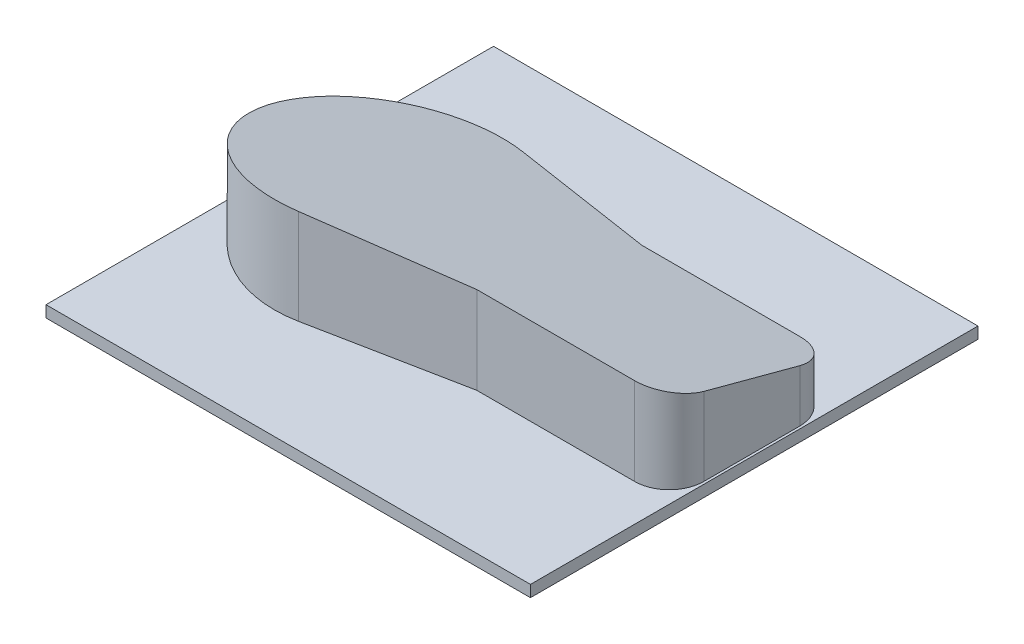
ISO-10303-21;
HEADER;
FILE_DESCRIPTION(('STEP AP214'),'2;1');
FILE_NAME('part.step','',(''),(''),'','','');
FILE_SCHEMA(('AUTOMOTIVE_DESIGN { 1 0 10303 214 1 1 1 1 }'));
ENDSEC;
DATA;
#1=APPLICATION_CONTEXT('core data for automotive mechanical design processes');
#2=APPLICATION_PROTOCOL_DEFINITION('international standard','automotive_design',2000,#1);
#3=PRODUCT_CONTEXT('',#1,'mechanical');
#4=PRODUCT('Part','Part','',(#3));
#5=PRODUCT_RELATED_PRODUCT_CATEGORY('part','',(#4));
#6=PRODUCT_DEFINITION_FORMATION('','',#4);
#7=PRODUCT_DEFINITION_CONTEXT('part definition',#1,'design');
#8=PRODUCT_DEFINITION('design','',#6,#7);
#9=PRODUCT_DEFINITION_SHAPE('','',#8);
#10=(LENGTH_UNIT() NAMED_UNIT(*) SI_UNIT(.MILLI.,.METRE.));
#11=(NAMED_UNIT(*) PLANE_ANGLE_UNIT() SI_UNIT($,.RADIAN.));
#12=(NAMED_UNIT(*) SI_UNIT($,.STERADIAN.) SOLID_ANGLE_UNIT());
#13=UNCERTAINTY_MEASURE_WITH_UNIT(LENGTH_MEASURE(1.E-05),#10,'distance_accuracy_value','');
#14=(GEOMETRIC_REPRESENTATION_CONTEXT(3) GLOBAL_UNCERTAINTY_ASSIGNED_CONTEXT((#13)) GLOBAL_UNIT_ASSIGNED_CONTEXT((#10,
#11,#12)) REPRESENTATION_CONTEXT('',''));
#15=CARTESIAN_POINT('',(0.,0.,0.));
#16=DIRECTION('',(0.,0.,1.));
#17=DIRECTION('',(1.,0.,0.));
#18=AXIS2_PLACEMENT_3D('',#15,#16,#17);
#19=CARTESIAN_POINT('',(0.,5.,0.));
#20=DIRECTION('',(1.,0.,0.));
#21=DIRECTION('',(0.,0.,-1.));
#22=AXIS2_PLACEMENT_3D('',#19,#20,#21);
#23=PLANE('',#22);
#24=DIRECTION('',(0.,0.,1.));
#25=VECTOR('',#24,1.);
#26=CARTESIAN_POINT('',(0.,0.,0.));
#27=LINE('',#26,#25);
#28=CARTESIAN_POINT('',(0.,0.,0.));
#29=VERTEX_POINT('',#28);
#30=CARTESIAN_POINT('',(0.,0.,194.));
#31=VERTEX_POINT('',#30);
#32=EDGE_CURVE('E357',#29,#31,#27,.T.);
#33=ORIENTED_EDGE('',*,*,#32,.T.);
#34=DIRECTION('',(0.,-1.,0.));
#35=VECTOR('',#34,1.);
#36=CARTESIAN_POINT('',(0.,5.,194.));
#37=LINE('',#36,#35);
#38=CARTESIAN_POINT('',(0.,5.,194.));
#39=VERTEX_POINT('',#38);
#40=EDGE_CURVE('E383',#39,#31,#37,.T.);
#41=ORIENTED_EDGE('',*,*,#40,.F.);
#42=DIRECTION('',(0.,0.,1.));
#43=VECTOR('',#42,1.);
#44=CARTESIAN_POINT('',(0.,5.,0.));
#45=LINE('',#44,#43);
#46=CARTESIAN_POINT('',(0.,5.,0.));
#47=VERTEX_POINT('',#46);
#48=EDGE_CURVE('E358',#47,#39,#45,.T.);
#49=ORIENTED_EDGE('',*,*,#48,.F.);
#50=DIRECTION('',(0.,-1.,0.));
#51=VECTOR('',#50,1.);
#52=CARTESIAN_POINT('',(0.,5.,0.));
#53=LINE('',#52,#51);
#54=EDGE_CURVE('E368',#47,#29,#53,.T.);
#55=ORIENTED_EDGE('',*,*,#54,.T.);
#56=EDGE_LOOP('',(#33,#41,#49,#55));
#57=FACE_BOUND('',#56,.T.);
#58=ADVANCED_FACE('F36',(#57),#23,.F.);
#59=CARTESIAN_POINT('',(0.,5.,194.));
#60=DIRECTION('',(0.,0.,-1.));
#61=DIRECTION('',(-1.,0.,0.));
#62=AXIS2_PLACEMENT_3D('',#59,#60,#61);
#63=PLANE('',#62);
#64=DIRECTION('',(1.,0.,0.));
#65=VECTOR('',#64,1.);
#66=CARTESIAN_POINT('',(0.,0.,194.));
#67=LINE('',#66,#65);
#68=CARTESIAN_POINT('',(210.,0.,194.));
#69=VERTEX_POINT('',#68);
#70=EDGE_CURVE('E370',#31,#69,#67,.T.);
#71=ORIENTED_EDGE('',*,*,#70,.T.);
#72=DIRECTION('',(0.,-1.,0.));
#73=VECTOR('',#72,1.);
#74=CARTESIAN_POINT('',(210.,5.,194.));
#75=LINE('',#74,#73);
#76=CARTESIAN_POINT('',(210.,5.,194.));
#77=VERTEX_POINT('',#76);
#78=EDGE_CURVE('E380',#77,#69,#75,.T.);
#79=ORIENTED_EDGE('',*,*,#78,.F.);
#80=DIRECTION('',(1.,0.,0.));
#81=VECTOR('',#80,1.);
#82=CARTESIAN_POINT('',(0.,5.,194.));
#83=LINE('',#82,#81);
#84=EDGE_CURVE('E361',#39,#77,#83,.T.);
#85=ORIENTED_EDGE('',*,*,#84,.F.);
#86=ORIENTED_EDGE('',*,*,#40,.T.);
#87=EDGE_LOOP('',(#71,#79,#85,#86));
#88=FACE_BOUND('',#87,.T.);
#89=ADVANCED_FACE('F280',(#88),#63,.F.);
#90=CARTESIAN_POINT('',(210.,5.,0.));
#91=DIRECTION('',(-1.,0.,0.));
#92=DIRECTION('',(0.,0.,1.));
#93=AXIS2_PLACEMENT_3D('',#90,#91,#92);
#94=PLANE('',#93);
#95=DIRECTION('',(0.,0.,-1.));
#96=VECTOR('',#95,1.);
#97=CARTESIAN_POINT('',(210.,0.,0.));
#98=LINE('',#97,#96);
#99=CARTESIAN_POINT('',(210.,0.,0.));
#100=VERTEX_POINT('',#99);
#101=EDGE_CURVE('E372',#69,#100,#98,.T.);
#102=ORIENTED_EDGE('',*,*,#101,.T.);
#103=DIRECTION('',(0.,-1.,0.));
#104=VECTOR('',#103,1.);
#105=CARTESIAN_POINT('',(210.,5.,0.));
#106=LINE('',#105,#104);
#107=CARTESIAN_POINT('',(210.,5.,0.));
#108=VERTEX_POINT('',#107);
#109=EDGE_CURVE('E377',#108,#100,#106,.T.);
#110=ORIENTED_EDGE('',*,*,#109,.F.);
#111=DIRECTION('',(0.,0.,-1.));
#112=VECTOR('',#111,1.);
#113=CARTESIAN_POINT('',(210.,5.,0.));
#114=LINE('',#113,#112);
#115=EDGE_CURVE('E364',#77,#108,#114,.T.);
#116=ORIENTED_EDGE('',*,*,#115,.F.);
#117=ORIENTED_EDGE('',*,*,#78,.T.);
#118=EDGE_LOOP('',(#102,#110,#116,#117));
#119=FACE_BOUND('',#118,.T.);
#120=ADVANCED_FACE('F286',(#119),#94,.F.);
#121=CARTESIAN_POINT('',(0.,5.,0.));
#122=DIRECTION('',(0.,0.,1.));
#123=DIRECTION('',(1.,0.,0.));
#124=AXIS2_PLACEMENT_3D('',#121,#122,#123);
#125=PLANE('',#124);
#126=DIRECTION('',(-1.,0.,0.));
#127=VECTOR('',#126,1.);
#128=CARTESIAN_POINT('',(0.,0.,0.));
#129=LINE('',#128,#127);
#130=EDGE_CURVE('E362',#100,#29,#129,.T.);
#131=ORIENTED_EDGE('',*,*,#130,.T.);
#132=ORIENTED_EDGE('',*,*,#54,.F.);
#133=DIRECTION('',(-1.,0.,0.));
#134=VECTOR('',#133,1.);
#135=CARTESIAN_POINT('',(0.,5.,0.));
#136=LINE('',#135,#134);
#137=EDGE_CURVE('E366',#108,#47,#136,.T.);
#138=ORIENTED_EDGE('',*,*,#137,.F.);
#139=ORIENTED_EDGE('',*,*,#109,.T.);
#140=EDGE_LOOP('',(#131,#132,#138,#139));
#141=FACE_BOUND('',#140,.T.);
#142=ADVANCED_FACE('F438',(#141),#125,.F.);
#143=CARTESIAN_POINT('',(0.,5.,0.));
#144=DIRECTION('',(0.,1.,0.));
#145=DIRECTION('',(0.,0.,1.));
#146=AXIS2_PLACEMENT_3D('',#143,#144,#145);
#147=PLANE('',#146);
#148=CARTESIAN_POINT('',(51.45,5.,97.));
#149=DIRECTION('',(0.,1.,0.));
#150=DIRECTION('',(0.,0.,1.));
#151=AXIS2_PLACEMENT_3D('',#148,#149,#150);
#152=CIRCLE('',#151,49.45);
#153=CARTESIAN_POINT('',(61.0263246268657,5.,48.4861204742304));
#154=VERTEX_POINT('',#153);
#155=CARTESIAN_POINT('',(61.0263246268657,5.,145.51387952577));
#156=VERTEX_POINT('',#155);
#157=EDGE_CURVE('E341',#154,#156,#152,.T.);
#158=ORIENTED_EDGE('',*,*,#157,.F.);
#159=DIRECTION('',(-0.981069353402823,0.,-0.193656716417911));
#160=VECTOR('',#159,1.);
#161=CARTESIAN_POINT('',(61.0263246268657,5.,48.4861204742304));
#162=LINE('',#161,#160);
#163=CARTESIAN_POINT('',(125.513628731343,5.,61.215495334632));
#164=VERTEX_POINT('',#163);
#165=EDGE_CURVE('E346',#164,#154,#162,.T.);
#166=ORIENTED_EDGE('',*,*,#165,.F.);
#167=DIRECTION('',(-1.,0.,0.));
#168=VECTOR('',#167,1.);
#169=CARTESIAN_POINT('',(125.513628731343,5.,61.215495334632));
#170=LINE('',#169,#168);
#171=CARTESIAN_POINT('',(193.95,5.,61.215495334632));
#172=VERTEX_POINT('',#171);
#173=EDGE_CURVE('E339',#172,#164,#170,.T.);
#174=ORIENTED_EDGE('',*,*,#173,.F.);
#175=CARTESIAN_POINT('',(193.95,5.,76.215495334632));
#176=DIRECTION('',(0.,1.,0.));
#177=DIRECTION('',(0.,0.,1.));
#178=AXIS2_PLACEMENT_3D('',#175,#176,#177);
#179=CIRCLE('',#178,15.);
#180=CARTESIAN_POINT('',(208.95,5.,76.215495334632));
#181=VERTEX_POINT('',#180);
#182=EDGE_CURVE('E11',#172,#181,#179,.F.);
#183=ORIENTED_EDGE('',*,*,#182,.T.);
#184=DIRECTION('',(0.,0.,-1.));
#185=VECTOR('',#184,1.);
#186=CARTESIAN_POINT('',(208.95,5.,61.215495334632));
#187=LINE('',#186,#185);
#188=CARTESIAN_POINT('',(208.95,5.,117.784504665368));
#189=VERTEX_POINT('',#188);
#190=EDGE_CURVE('E332',#189,#181,#187,.T.);
#191=ORIENTED_EDGE('',*,*,#190,.F.);
#192=CARTESIAN_POINT('',(193.95,5.,117.784504665368));
#193=DIRECTION('',(0.,1.,0.));
#194=DIRECTION('',(0.,0.,1.));
#195=AXIS2_PLACEMENT_3D('',#192,#193,#194);
#196=CIRCLE('',#195,15.);
#197=CARTESIAN_POINT('',(193.95,5.,132.784504665368));
#198=VERTEX_POINT('',#197);
#199=EDGE_CURVE('E44',#189,#198,#196,.F.);
#200=ORIENTED_EDGE('',*,*,#199,.T.);
#201=DIRECTION('',(1.,0.,0.));
#202=VECTOR('',#201,1.);
#203=CARTESIAN_POINT('',(208.95,5.,132.784504665368));
#204=LINE('',#203,#202);
#205=CARTESIAN_POINT('',(125.513628731343,5.,132.784504665368));
#206=VERTEX_POINT('',#205);
#207=EDGE_CURVE('E329',#206,#198,#204,.T.);
#208=ORIENTED_EDGE('',*,*,#207,.F.);
#209=DIRECTION('',(0.981069353402823,0.,-0.193656716417911));
#210=VECTOR('',#209,1.);
#211=CARTESIAN_POINT('',(61.0263246268657,5.,145.51387952577));
#212=LINE('',#211,#210);
#213=EDGE_CURVE('E337',#156,#206,#212,.T.);
#214=ORIENTED_EDGE('',*,*,#213,.F.);
#215=EDGE_LOOP('',(#158,#166,#174,#183,#191,#200,#208,#214));
#216=FACE_BOUND('',#215,.T.);
#217=ORIENTED_EDGE('',*,*,#48,.T.);
#218=ORIENTED_EDGE('',*,*,#84,.T.);
#219=ORIENTED_EDGE('',*,*,#115,.T.);
#220=ORIENTED_EDGE('',*,*,#137,.T.);
#221=EDGE_LOOP('',(#217,#218,#219,#220));
#222=FACE_BOUND('',#221,.T.);
#223=ADVANCED_FACE('F326',(#216,#222),#147,.T.);
#224=CARTESIAN_POINT('',(0.,0.,0.));
#225=DIRECTION('',(0.,1.,0.));
#226=DIRECTION('',(0.,0.,1.));
#227=AXIS2_PLACEMENT_3D('',#224,#225,#226);
#228=PLANE('',#227);
#229=DIRECTION('',(-0.981069353402823,0.,0.193656716417911));
#230=VECTOR('',#229,1.);
#231=CARTESIAN_POINT('',(124.536092452337,0.,122.784504665368));
#232=LINE('',#231,#230);
#233=CARTESIAN_POINT('',(124.536092452337,0.,122.784504665368));
#234=VERTEX_POINT('',#233);
#235=CARTESIAN_POINT('',(59.0897574626866,0.,135.703185991741));
#236=VERTEX_POINT('',#235);
#237=EDGE_CURVE('E684',#234,#236,#232,.T.);
#238=ORIENTED_EDGE('',*,*,#237,.F.);
#239=DIRECTION('',(-1.,0.,0.));
#240=VECTOR('',#239,1.);
#241=CARTESIAN_POINT('',(193.95,0.,122.784504665368));
#242=LINE('',#241,#240);
#243=CARTESIAN_POINT('',(193.95,0.,122.784504665368));
#244=VERTEX_POINT('',#243);
#245=EDGE_CURVE('E56',#244,#234,#242,.T.);
#246=ORIENTED_EDGE('',*,*,#245,.F.);
#247=CARTESIAN_POINT('',(193.95,0.,117.784504665368));
#248=DIRECTION('',(0.,-1.,0.));
#249=DIRECTION('',(0.,0.,-1.));
#250=AXIS2_PLACEMENT_3D('',#247,#248,#249);
#251=CIRCLE('',#250,4.99999999999998);
#252=CARTESIAN_POINT('',(198.95,0.,117.784504665368));
#253=VERTEX_POINT('',#252);
#254=EDGE_CURVE('E699',#253,#244,#251,.T.);
#255=ORIENTED_EDGE('',*,*,#254,.F.);
#256=DIRECTION('',(0.,0.,1.));
#257=VECTOR('',#256,1.);
#258=CARTESIAN_POINT('',(198.95,0.,76.215495334632));
#259=LINE('',#258,#257);
#260=CARTESIAN_POINT('',(198.95,0.,76.215495334632));
#261=VERTEX_POINT('',#260);
#262=EDGE_CURVE('E697',#261,#253,#259,.T.);
#263=ORIENTED_EDGE('',*,*,#262,.F.);
#264=CARTESIAN_POINT('',(193.95,0.,76.215495334632));
#265=DIRECTION('',(0.,-1.,0.));
#266=DIRECTION('',(0.,0.,-1.));
#267=AXIS2_PLACEMENT_3D('',#264,#265,#266);
#268=CIRCLE('',#267,5.);
#269=CARTESIAN_POINT('',(193.95,0.,71.215495334632));
#270=VERTEX_POINT('',#269);
#271=EDGE_CURVE('E208',#270,#261,#268,.T.);
#272=ORIENTED_EDGE('',*,*,#271,.F.);
#273=DIRECTION('',(1.,0.,0.));
#274=VECTOR('',#273,1.);
#275=CARTESIAN_POINT('',(124.536092452337,0.,71.215495334632));
#276=LINE('',#275,#274);
#277=CARTESIAN_POINT('',(124.536092452337,0.,71.215495334632));
#278=VERTEX_POINT('',#277);
#279=EDGE_CURVE('E693',#278,#270,#276,.T.);
#280=ORIENTED_EDGE('',*,*,#279,.F.);
#281=DIRECTION('',(0.981069353402823,0.,0.193656716417911));
#282=VECTOR('',#281,1.);
#283=CARTESIAN_POINT('',(59.0897574626865,0.,58.2968140082586));
#284=LINE('',#283,#282);
#285=CARTESIAN_POINT('',(59.0897574626865,0.,58.2968140082586));
#286=VERTEX_POINT('',#285);
#287=EDGE_CURVE('E690',#286,#278,#284,.T.);
#288=ORIENTED_EDGE('',*,*,#287,.F.);
#289=CARTESIAN_POINT('',(51.45,0.,97.));
#290=DIRECTION('',(0.,-1.,0.));
#291=DIRECTION('',(0.,0.,-1.));
#292=AXIS2_PLACEMENT_3D('',#289,#290,#291);
#293=CIRCLE('',#292,39.45);
#294=EDGE_CURVE('E687',#236,#286,#293,.T.);
#295=ORIENTED_EDGE('',*,*,#294,.F.);
#296=EDGE_LOOP('',(#238,#246,#255,#263,#272,#280,#288,#295));
#297=FACE_BOUND('',#296,.T.);
#298=ORIENTED_EDGE('',*,*,#32,.F.);
#299=ORIENTED_EDGE('',*,*,#130,.F.);
#300=ORIENTED_EDGE('',*,*,#101,.F.);
#301=ORIENTED_EDGE('',*,*,#70,.F.);
#302=EDGE_LOOP('',(#298,#299,#300,#301));
#303=FACE_BOUND('',#302,.T.);
#304=ADVANCED_FACE('F432',(#297,#303),#228,.F.);
#305=CARTESIAN_POINT('',(51.45,55.,97.));
#306=DIRECTION('',(0.,-1.,0.));
#307=DIRECTION('',(0.,0.,-1.));
#308=AXIS2_PLACEMENT_3D('',#305,#306,#307);
#309=CYLINDRICAL_SURFACE('',#308,49.45);
#310=CARTESIAN_POINT('',(51.45,33.2500875657191,97.));
#311=DIRECTION('',(0.,-0.965925826289068,0.258819045102522));
#312=DIRECTION('',(0.,-0.258819045102522,-0.965925826289068));
#313=AXIS2_PLACEMENT_3D('',#310,#311,#312);
#314=ELLIPSE('',#313,51.1944071212786,49.45);
#315=CARTESIAN_POINT('',(61.0263246268657,46.2493424063499,145.51387952577));
#316=VERTEX_POINT('',#315);
#317=CARTESIAN_POINT('',(61.0263246268657,20.2508327250883,48.4861204742304));
#318=VERTEX_POINT('',#317);
#319=EDGE_CURVE('E408',#316,#318,#314,.T.);
#320=ORIENTED_EDGE('',*,*,#319,.T.);
#321=DIRECTION('',(0.,-1.,0.));
#322=VECTOR('',#321,1.);
#323=CARTESIAN_POINT('',(61.0263246268657,55.,48.4861204742304));
#324=LINE('',#323,#322);
#325=EDGE_CURVE('E349',#318,#154,#324,.T.);
#326=ORIENTED_EDGE('',*,*,#325,.T.);
#327=ORIENTED_EDGE('',*,*,#157,.T.);
#328=DIRECTION('',(0.,-1.,0.));
#329=VECTOR('',#328,1.);
#330=CARTESIAN_POINT('',(61.0263246268657,55.,145.51387952577));
#331=LINE('',#330,#329);
#332=EDGE_CURVE('E355',#316,#156,#331,.T.);
#333=ORIENTED_EDGE('',*,*,#332,.F.);
#334=EDGE_LOOP('',(#320,#326,#327,#333));
#335=FACE_BOUND('',#334,.T.);
#336=ADVANCED_FACE('F412',(#335),#309,.T.);
#337=CARTESIAN_POINT('',(61.0263246268657,55.,145.51387952577));
#338=DIRECTION('',(-0.193656716417911,0.,-0.981069353402823));
#339=DIRECTION('',(-0.981069353402823,0.,0.193656716417911));
#340=AXIS2_PLACEMENT_3D('',#337,#338,#339);
#341=PLANE('',#340);
#342=DIRECTION('',(0.,-1.,0.));
#343=VECTOR('',#342,1.);
#344=CARTESIAN_POINT('',(125.513628731343,55.,132.784504665368));
#345=LINE('',#344,#343);
#346=CARTESIAN_POINT('',(125.513628731343,42.8385166923522,132.784504665368));
#347=VERTEX_POINT('',#346);
#348=EDGE_CURVE('E336',#347,#206,#345,.T.);
#349=ORIENTED_EDGE('',*,*,#348,.F.);
#350=DIRECTION('',(-0.979751206557731,0.0518204421018015,0.193396522794604));
#351=VECTOR('',#350,1.);
#352=CARTESIAN_POINT('',(60.582043759192,46.2728410566461,145.601577682584));
#353=LINE('',#352,#351);
#354=EDGE_CURVE('E399',#347,#316,#353,.T.);
#355=ORIENTED_EDGE('',*,*,#354,.T.);
#356=ORIENTED_EDGE('',*,*,#332,.T.);
#357=ORIENTED_EDGE('',*,*,#213,.T.);
#358=EDGE_LOOP('',(#349,#355,#356,#357));
#359=FACE_BOUND('',#358,.T.);
#360=ADVANCED_FACE('F424',(#359),#341,.F.);
#361=CARTESIAN_POINT('',(208.95,55.,132.784504665368));
#362=DIRECTION('',(0.,0.,-1.));
#363=DIRECTION('',(-1.,0.,0.));
#364=AXIS2_PLACEMENT_3D('',#361,#362,#363);
#365=PLANE('',#364);
#366=ORIENTED_EDGE('',*,*,#207,.T.);
#367=DIRECTION('',(0.,-1.,0.));
#368=VECTOR('',#367,1.);
#369=CARTESIAN_POINT('',(193.95,55.,132.784504665368));
#370=LINE('',#369,#368);
#371=CARTESIAN_POINT('',(193.95,42.8385166923522,132.784504665368));
#372=VERTEX_POINT('',#371);
#373=EDGE_CURVE('E308',#198,#372,#370,.F.);
#374=ORIENTED_EDGE('',*,*,#373,.T.);
#375=DIRECTION('',(-1.,0.,0.));
#376=VECTOR('',#375,1.);
#377=CARTESIAN_POINT('',(208.95,42.8385166923522,132.784504665368));
#378=LINE('',#377,#376);
#379=EDGE_CURVE('E396',#372,#347,#378,.T.);
#380=ORIENTED_EDGE('',*,*,#379,.T.);
#381=ORIENTED_EDGE('',*,*,#348,.T.);
#382=EDGE_LOOP('',(#366,#374,#380,#381));
#383=FACE_BOUND('',#382,.T.);
#384=ADVANCED_FACE('F334',(#383),#365,.F.);
#385=CARTESIAN_POINT('',(208.95,55.,61.215495334632));
#386=DIRECTION('',(-1.,0.,0.));
#387=DIRECTION('',(0.,0.,1.));
#388=AXIS2_PLACEMENT_3D('',#385,#386,#387);
#389=PLANE('',#388);
#390=DIRECTION('',(0.,0.258819045102522,0.965925826289068));
#391=VECTOR('',#390,1.);
#392=CARTESIAN_POINT('',(208.95,25.7609292674304,69.0500807248606));
#393=LINE('',#392,#391);
#394=CARTESIAN_POINT('',(208.95,27.6808963255528,76.215495334632));
#395=VERTEX_POINT('',#394);
#396=CARTESIAN_POINT('',(208.95,38.8192788058854,117.784504665368));
#397=VERTEX_POINT('',#396);
#398=EDGE_CURVE('E394',#395,#397,#393,.T.);
#399=ORIENTED_EDGE('',*,*,#398,.T.);
#400=DIRECTION('',(0.,-1.,0.));
#401=VECTOR('',#400,1.);
#402=CARTESIAN_POINT('',(208.95,55.,117.784504665368));
#403=LINE('',#402,#401);
#404=EDGE_CURVE('E310',#397,#189,#403,.T.);
#405=ORIENTED_EDGE('',*,*,#404,.T.);
#406=ORIENTED_EDGE('',*,*,#190,.T.);
#407=DIRECTION('',(0.,-1.,0.));
#408=VECTOR('',#407,1.);
#409=CARTESIAN_POINT('',(208.95,55.,76.215495334632));
#410=LINE('',#409,#408);
#411=EDGE_CURVE('E389',#181,#395,#410,.F.);
#412=ORIENTED_EDGE('',*,*,#411,.T.);
#413=EDGE_LOOP('',(#399,#405,#406,#412));
#414=FACE_BOUND('',#413,.T.);
#415=ADVANCED_FACE('F392',(#414),#389,.F.);
#416=CARTESIAN_POINT('',(125.513628731343,55.,61.215495334632));
#417=DIRECTION('',(0.,0.,1.));
#418=DIRECTION('',(1.,0.,0.));
#419=AXIS2_PLACEMENT_3D('',#416,#417,#418);
#420=PLANE('',#419);
#421=DIRECTION('',(1.,0.,0.));
#422=VECTOR('',#421,1.);
#423=CARTESIAN_POINT('',(125.513628731343,23.6616584390859,61.215495334632));
#424=LINE('',#423,#422);
#425=CARTESIAN_POINT('',(125.513628731343,23.6616584390859,61.215495334632));
#426=VERTEX_POINT('',#425);
#427=CARTESIAN_POINT('',(193.95,23.6616584390859,61.215495334632));
#428=VERTEX_POINT('',#427);
#429=EDGE_CURVE('E397',#426,#428,#424,.T.);
#430=ORIENTED_EDGE('',*,*,#429,.T.);
#431=DIRECTION('',(0.,-1.,0.));
#432=VECTOR('',#431,1.);
#433=CARTESIAN_POINT('',(193.95,55.,61.215495334632));
#434=LINE('',#433,#432);
#435=EDGE_CURVE('E314',#428,#172,#434,.T.);
#436=ORIENTED_EDGE('',*,*,#435,.T.);
#437=ORIENTED_EDGE('',*,*,#173,.T.);
#438=DIRECTION('',(0.,-1.,0.));
#439=VECTOR('',#438,1.);
#440=CARTESIAN_POINT('',(125.513628731343,55.,61.215495334632));
#441=LINE('',#440,#439);
#442=EDGE_CURVE('E351',#426,#164,#441,.T.);
#443=ORIENTED_EDGE('',*,*,#442,.F.);
#444=EDGE_LOOP('',(#430,#436,#437,#443));
#445=FACE_BOUND('',#444,.T.);
#446=ADVANCED_FACE('F420',(#445),#420,.F.);
#447=CARTESIAN_POINT('',(61.0263246268657,55.,48.4861204742304));
#448=DIRECTION('',(-0.193656716417911,0.,0.981069353402823));
#449=DIRECTION('',(0.981069353402823,0.,0.193656716417911));
#450=AXIS2_PLACEMENT_3D('',#447,#448,#449);
#451=PLANE('',#450);
#452=ORIENTED_EDGE('',*,*,#325,.F.);
#453=DIRECTION('',(0.979751206557731,0.0518204421018015,0.193396522794604));
#454=VECTOR('',#453,1.);
#455=CARTESIAN_POINT('',(62.7905794868705,20.3441466870551,48.8343729213462));
#456=LINE('',#455,#454);
#457=EDGE_CURVE('E386',#318,#426,#456,.T.);
#458=ORIENTED_EDGE('',*,*,#457,.T.);
#459=ORIENTED_EDGE('',*,*,#442,.T.);
#460=ORIENTED_EDGE('',*,*,#165,.T.);
#461=EDGE_LOOP('',(#452,#458,#459,#460));
#462=FACE_BOUND('',#461,.T.);
#463=ADVANCED_FACE('F301',(#462),#451,.F.);
#464=CARTESIAN_POINT('',(210.,46.5001751314381,146.45));
#465=DIRECTION('',(0.,-0.965925826289068,0.258819045102522));
#466=DIRECTION('',(0.,-0.258819045102522,-0.965925826289068));
#467=AXIS2_PLACEMENT_3D('',#464,#465,#466);
#468=PLANE('',#467);
#469=ORIENTED_EDGE('',*,*,#379,.F.);
#470=CARTESIAN_POINT('',(193.95,38.8192788058854,117.784504665368));
#471=DIRECTION('',(0.,-0.965925826289068,0.258819045102522));
#472=DIRECTION('',(0.,-0.258819045102522,-0.965925826289068));
#473=AXIS2_PLACEMENT_3D('',#470,#471,#472);
#474=ELLIPSE('',#473,15.5291427061512,15.);
#475=EDGE_CURVE('E307',#372,#397,#474,.F.);
#476=ORIENTED_EDGE('',*,*,#475,.T.);
#477=ORIENTED_EDGE('',*,*,#398,.F.);
#478=CARTESIAN_POINT('',(193.95,27.6808963255528,76.215495334632));
#479=DIRECTION('',(0.,-0.965925826289068,0.258819045102522));
#480=DIRECTION('',(0.,-0.258819045102522,-0.965925826289068));
#481=AXIS2_PLACEMENT_3D('',#478,#479,#480);
#482=ELLIPSE('',#481,15.5291427061512,15.);
#483=EDGE_CURVE('E315',#395,#428,#482,.F.);
#484=ORIENTED_EDGE('',*,*,#483,.T.);
#485=ORIENTED_EDGE('',*,*,#429,.F.);
#486=ORIENTED_EDGE('',*,*,#457,.F.);
#487=ORIENTED_EDGE('',*,*,#319,.F.);
#488=ORIENTED_EDGE('',*,*,#354,.F.);
#489=EDGE_LOOP('',(#469,#476,#477,#484,#485,#486,#487,#488));
#490=FACE_BOUND('',#489,.T.);
#491=ADVANCED_FACE('F293',(#490),#468,.F.);
#492=CARTESIAN_POINT('',(193.95,55.,117.784504665368));
#493=DIRECTION('',(0.,-1.,0.));
#494=DIRECTION('',(0.,0.,-1.));
#495=AXIS2_PLACEMENT_3D('',#492,#493,#494);
#496=CYLINDRICAL_SURFACE('',#495,15.);
#497=ORIENTED_EDGE('',*,*,#475,.F.);
#498=ORIENTED_EDGE('',*,*,#373,.F.);
#499=ORIENTED_EDGE('',*,*,#199,.F.);
#500=ORIENTED_EDGE('',*,*,#404,.F.);
#501=EDGE_LOOP('',(#497,#498,#499,#500));
#502=FACE_BOUND('',#501,.T.);
#503=ADVANCED_FACE('F291',(#502),#496,.T.);
#504=CARTESIAN_POINT('',(193.95,55.,76.215495334632));
#505=DIRECTION('',(0.,-1.,0.));
#506=DIRECTION('',(0.,0.,-1.));
#507=AXIS2_PLACEMENT_3D('',#504,#505,#506);
#508=CYLINDRICAL_SURFACE('',#507,15.);
#509=ORIENTED_EDGE('',*,*,#483,.F.);
#510=ORIENTED_EDGE('',*,*,#411,.F.);
#511=ORIENTED_EDGE('',*,*,#182,.F.);
#512=ORIENTED_EDGE('',*,*,#435,.F.);
#513=EDGE_LOOP('',(#509,#510,#511,#512));
#514=FACE_BOUND('',#513,.T.);
#515=ADVANCED_FACE('F38',(#514),#508,.T.);
#516=CARTESIAN_POINT('',(193.95,15.,122.784504665368));
#517=DIRECTION('',(0.,0.,1.));
#518=DIRECTION('',(1.,0.,0.));
#519=AXIS2_PLACEMENT_3D('',#516,#517,#518);
#520=PLANE('',#519);
#521=ORIENTED_EDGE('',*,*,#245,.T.);
#522=DIRECTION('',(0.,-1.,0.));
#523=VECTOR('',#522,1.);
#524=CARTESIAN_POINT('',(124.536092452337,15.,122.784504665368));
#525=LINE('',#524,#523);
#526=CARTESIAN_POINT('',(124.536092452337,29.8062629639401,122.784504665368));
#527=VERTEX_POINT('',#526);
#528=EDGE_CURVE('E51',#527,#234,#525,.T.);
#529=ORIENTED_EDGE('',*,*,#528,.F.);
#530=DIRECTION('',(-1.,0.,0.));
#531=VECTOR('',#530,1.);
#532=CARTESIAN_POINT('',(197.364055751034,29.8062629639401,122.784504665368));
#533=LINE('',#532,#531);
#534=CARTESIAN_POINT('',(193.95,29.8062629639402,122.784504665368));
#535=VERTEX_POINT('',#534);
#536=EDGE_CURVE('E231',#535,#527,#533,.T.);
#537=ORIENTED_EDGE('',*,*,#536,.F.);
#538=DIRECTION('',(0.,-1.,0.));
#539=VECTOR('',#538,1.);
#540=CARTESIAN_POINT('',(193.95,15.,122.784504665368));
#541=LINE('',#540,#539);
#542=EDGE_CURVE('E402',#535,#244,#541,.T.);
#543=ORIENTED_EDGE('',*,*,#542,.T.);
#544=EDGE_LOOP('',(#521,#529,#537,#543));
#545=FACE_BOUND('',#544,.T.);
#546=ADVANCED_FACE('F299',(#545),#520,.F.);
#547=CARTESIAN_POINT('',(193.95,15.,117.784504665368));
#548=DIRECTION('',(0.,-1.,0.));
#549=DIRECTION('',(0.,0.,-1.));
#550=AXIS2_PLACEMENT_3D('',#547,#548,#549);
#551=CYLINDRICAL_SURFACE('',#550,4.99999999999998);
#552=ORIENTED_EDGE('',*,*,#254,.T.);
#553=ORIENTED_EDGE('',*,*,#542,.F.);
#554=CARTESIAN_POINT('',(193.95,28.4665170017845,117.784504665368));
#555=DIRECTION('',(0.,-0.965925826289067,0.258819045102526));
#556=DIRECTION('',(0.,-0.258819045102526,-0.965925826289067));
#557=AXIS2_PLACEMENT_3D('',#554,#555,#556);
#558=ELLIPSE('',#557,5.17638090205041,4.99999999999998);
#559=CARTESIAN_POINT('',(198.95,28.4665170017845,117.784504665368));
#560=VERTEX_POINT('',#559);
#561=EDGE_CURVE('E254',#560,#535,#558,.T.);
#562=ORIENTED_EDGE('',*,*,#561,.F.);
#563=DIRECTION('',(0.,-1.,0.));
#564=VECTOR('',#563,1.);
#565=CARTESIAN_POINT('',(198.95,15.,117.784504665368));
#566=LINE('',#565,#564);
#567=EDGE_CURVE('E212',#560,#253,#566,.T.);
#568=ORIENTED_EDGE('',*,*,#567,.T.);
#569=EDGE_LOOP('',(#552,#553,#562,#568));
#570=FACE_BOUND('',#569,.T.);
#571=ADVANCED_FACE('F528',(#570),#551,.F.);
#572=CARTESIAN_POINT('',(198.95,15.,76.215495334632));
#573=DIRECTION('',(1.,0.,0.));
#574=DIRECTION('',(0.,0.,-1.));
#575=AXIS2_PLACEMENT_3D('',#572,#573,#574);
#576=PLANE('',#575);
#577=ORIENTED_EDGE('',*,*,#262,.T.);
#578=ORIENTED_EDGE('',*,*,#567,.F.);
#579=DIRECTION('',(0.,-0.258819045102522,-0.965925826289068));
#580=VECTOR('',#579,1.);
#581=CARTESIAN_POINT('',(198.95,29.1600205429947,120.372695116393));
#582=LINE('',#581,#580);
#583=CARTESIAN_POINT('',(198.95,29.1600205429947,120.372695116393));
#584=VERTEX_POINT('',#583);
#585=EDGE_CURVE('E643',#584,#560,#582,.T.);
#586=ORIENTED_EDGE('',*,*,#585,.F.);
#587=DIRECTION('',(0.,0.965925826289068,-0.258819045102522));
#588=VECTOR('',#587,1.);
#589=CARTESIAN_POINT('',(198.95,29.1600205429947,120.372695116393));
#590=LINE('',#589,#588);
#591=CARTESIAN_POINT('',(198.95,33.98964967444,119.078599890881));
#592=VERTEX_POINT('',#591);
#593=EDGE_CURVE('E219',#584,#592,#590,.T.);
#594=ORIENTED_EDGE('',*,*,#593,.T.);
#595=DIRECTION('',(0.,-0.258819045102522,-0.965925826289068));
#596=VECTOR('',#595,1.);
#597=CARTESIAN_POINT('',(198.95,33.98964967444,119.078599890881));
#598=LINE('',#597,#596);
#599=CARTESIAN_POINT('',(198.95,22.5045154235022,76.215495334632));
#600=VERTEX_POINT('',#599);
#601=EDGE_CURVE('E216',#592,#600,#598,.T.);
#602=ORIENTED_EDGE('',*,*,#601,.T.);
#603=DIRECTION('',(0.,-1.,0.));
#604=VECTOR('',#603,1.);
#605=CARTESIAN_POINT('',(198.95,15.,76.215495334632));
#606=LINE('',#605,#604);
#607=EDGE_CURVE('E201',#600,#261,#606,.T.);
#608=ORIENTED_EDGE('',*,*,#607,.T.);
#609=EDGE_LOOP('',(#577,#578,#586,#594,#602,#608));
#610=FACE_BOUND('',#609,.T.);
#611=ADVANCED_FACE('F217',(#610),#576,.F.);
#612=CARTESIAN_POINT('',(193.95,15.,76.215495334632));
#613=DIRECTION('',(0.,-1.,0.));
#614=DIRECTION('',(0.,0.,-1.));
#615=AXIS2_PLACEMENT_3D('',#612,#613,#614);
#616=CYLINDRICAL_SURFACE('',#615,5.);
#617=ORIENTED_EDGE('',*,*,#271,.T.);
#618=ORIENTED_EDGE('',*,*,#607,.F.);
#619=CARTESIAN_POINT('',(193.95,22.5045154235022,76.215495334632));
#620=DIRECTION('',(0.,-0.965925826289067,0.258819045102526));
#621=DIRECTION('',(0.,-0.258819045102526,-0.965925826289067));
#622=AXIS2_PLACEMENT_3D('',#619,#620,#621);
#623=ELLIPSE('',#622,5.17638090205043,5.);
#624=CARTESIAN_POINT('',(193.95,21.1647694613465,71.215495334632));
#625=VERTEX_POINT('',#624);
#626=EDGE_CURVE('E205',#600,#625,#623,.F.);
#627=ORIENTED_EDGE('',*,*,#626,.T.);
#628=DIRECTION('',(0.,-1.,0.));
#629=VECTOR('',#628,1.);
#630=CARTESIAN_POINT('',(193.95,15.,71.215495334632));
#631=LINE('',#630,#629);
#632=EDGE_CURVE('E213',#625,#270,#631,.T.);
#633=ORIENTED_EDGE('',*,*,#632,.T.);
#634=EDGE_LOOP('',(#617,#618,#627,#633));
#635=FACE_BOUND('',#634,.T.);
#636=ADVANCED_FACE('F203',(#635),#616,.F.);
#637=CARTESIAN_POINT('',(124.536092452337,15.,71.215495334632));
#638=DIRECTION('',(0.,0.,-1.));
#639=DIRECTION('',(-1.,0.,0.));
#640=AXIS2_PLACEMENT_3D('',#637,#638,#639);
#641=PLANE('',#640);
#642=ORIENTED_EDGE('',*,*,#279,.T.);
#643=ORIENTED_EDGE('',*,*,#632,.F.);
#644=DIRECTION('',(-1.,0.,0.));
#645=VECTOR('',#644,1.);
#646=CARTESIAN_POINT('',(124.536092452337,21.1647694613465,71.215495334632));
#647=LINE('',#646,#645);
#648=CARTESIAN_POINT('',(124.536092452337,21.1647694613465,71.215495334632));
#649=VERTEX_POINT('',#648);
#650=EDGE_CURVE('E230',#625,#649,#647,.T.);
#651=ORIENTED_EDGE('',*,*,#650,.T.);
#652=DIRECTION('',(0.,-1.,0.));
#653=VECTOR('',#652,1.);
#654=CARTESIAN_POINT('',(124.536092452337,15.,71.215495334632));
#655=LINE('',#654,#653);
#656=EDGE_CURVE('E705',#649,#278,#655,.T.);
#657=ORIENTED_EDGE('',*,*,#656,.T.);
#658=EDGE_LOOP('',(#642,#643,#651,#657));
#659=FACE_BOUND('',#658,.T.);
#660=ADVANCED_FACE('F549',(#659),#641,.F.);
#661=CARTESIAN_POINT('',(59.0897574626865,15.,58.2968140082586));
#662=DIRECTION('',(0.193656716417911,0.,-0.981069353402823));
#663=DIRECTION('',(-0.981069353402823,0.,-0.193656716417911));
#664=AXIS2_PLACEMENT_3D('',#661,#662,#663);
#665=PLANE('',#664);
#666=ORIENTED_EDGE('',*,*,#287,.T.);
#667=ORIENTED_EDGE('',*,*,#656,.F.);
#668=DIRECTION('',(-0.979751206557731,-0.0518204421018026,-0.193396522794604));
#669=VECTOR('',#668,1.);
#670=CARTESIAN_POINT('',(70.1003457952932,18.2855849918314,60.4702326100386));
#671=LINE('',#670,#669);
#672=CARTESIAN_POINT('',(59.0897574626866,17.7032192326696,58.2968140082586));
#673=VERTEX_POINT('',#672);
#674=EDGE_CURVE('E236',#649,#673,#671,.T.);
#675=ORIENTED_EDGE('',*,*,#674,.T.);
#676=DIRECTION('',(0.,-1.,0.));
#677=VECTOR('',#676,1.);
#678=CARTESIAN_POINT('',(59.0897574626865,15.,58.2968140082586));
#679=LINE('',#678,#677);
#680=EDGE_CURVE('E707',#673,#286,#679,.T.);
#681=ORIENTED_EDGE('',*,*,#680,.T.);
#682=EDGE_LOOP('',(#666,#667,#675,#681));
#683=FACE_BOUND('',#682,.T.);
#684=ADVANCED_FACE('F556',(#683),#665,.F.);
#685=CARTESIAN_POINT('',(51.45,15.,97.));
#686=DIRECTION('',(0.,-1.,0.));
#687=DIRECTION('',(0.,0.,-1.));
#688=AXIS2_PLACEMENT_3D('',#685,#686,#687);
#689=CYLINDRICAL_SURFACE('',#688,39.45);
#690=ORIENTED_EDGE('',*,*,#294,.T.);
#691=ORIENTED_EDGE('',*,*,#680,.F.);
#692=CARTESIAN_POINT('',(51.45,28.0737066636685,97.));
#693=DIRECTION('',(0.,-0.965925826289067,0.258819045102526));
#694=DIRECTION('',(0.,-0.258819045102526,-0.965925826289067));
#695=AXIS2_PLACEMENT_3D('',#692,#693,#694);
#696=ELLIPSE('',#695,40.8416453171779,39.45);
#697=CARTESIAN_POINT('',(12.0053098573327,28.2471340847711,97.6472399469804));
#698=VERTEX_POINT('',#697);
#699=EDGE_CURVE('E729',#673,#698,#696,.F.);
#700=ORIENTED_EDGE('',*,*,#699,.T.);
#701=CARTESIAN_POINT('',(12.0212302240685,23.2440704409129,98.2940687603819));
#702=CARTESIAN_POINT('',(12.0176930651369,24.0779160153838,98.1862983474625));
#703=CARTESIAN_POINT('',(12.014597788443,24.9117607729408,98.078510739886));
#704=CARTESIAN_POINT('',(12.0092909995311,26.5794486542269,97.8629011354187));
#705=CARTESIAN_POINT('',(12.007079487313,27.413291777956,97.755079138528));
#706=CARTESIAN_POINT('',(12.0053098573327,28.2471340847712,97.6472399469801));
#707=B_SPLINE_CURVE_WITH_KNOTS('',3,(#701,#702,#703,#704,#705,#706),.UNSPECIFIED.,.F.,.F.,(4,2,
4),(0.,2.52236465625237,5.04472931250474),.UNSPECIFIED.);
#708=CARTESIAN_POINT('',(12.0212302240685,23.2440704409129,98.294068760382));
#709=VERTEX_POINT('',#708);
#710=EDGE_CURVE('E245',#709,#698,#707,.T.);
#711=ORIENTED_EDGE('',*,*,#710,.F.);
#712=CARTESIAN_POINT('',(51.45,22.8973257616181,97.));
#713=DIRECTION('',(0.,-0.965925826289067,0.258819045102526));
#714=DIRECTION('',(0.,-0.258819045102526,-0.965925826289067));
#715=AXIS2_PLACEMENT_3D('',#712,#713,#714);
#716=ELLIPSE('',#715,40.8416453171779,39.45);
#717=CARTESIAN_POINT('',(59.0897574626865,33.267813192617,135.703185991741));
#718=VERTEX_POINT('',#717);
#719=EDGE_CURVE('E242',#718,#709,#716,.T.);
#720=ORIENTED_EDGE('',*,*,#719,.F.);
#721=DIRECTION('',(0.,-1.,0.));
#722=VECTOR('',#721,1.);
#723=CARTESIAN_POINT('',(59.0897574626866,15.,135.703185991741));
#724=LINE('',#723,#722);
#725=EDGE_CURVE('E709',#718,#236,#724,.T.);
#726=ORIENTED_EDGE('',*,*,#725,.T.);
#727=EDGE_LOOP('',(#690,#691,#700,#711,#720,#726));
#728=FACE_BOUND('',#727,.T.);
#729=ADVANCED_FACE('F276',(#728),#689,.F.);
#730=CARTESIAN_POINT('',(124.536092452337,15.,122.784504665368));
#731=DIRECTION('',(0.193656716417911,0.,0.981069353402823));
#732=DIRECTION('',(0.981069353402823,0.,-0.193656716417911));
#733=AXIS2_PLACEMENT_3D('',#730,#731,#732);
#734=PLANE('',#733);
#735=ORIENTED_EDGE('',*,*,#237,.T.);
#736=ORIENTED_EDGE('',*,*,#725,.F.);
#737=DIRECTION('',(-0.979751206557731,0.0518204421018026,0.193396522794604));
#738=VECTOR('',#737,1.);
#739=CARTESIAN_POINT('',(194.143170691175,26.1246450760434,109.044519653683));
#740=LINE('',#739,#738);
#741=EDGE_CURVE('E234',#527,#718,#740,.T.);
#742=ORIENTED_EDGE('',*,*,#741,.F.);
#743=ORIENTED_EDGE('',*,*,#528,.T.);
#744=EDGE_LOOP('',(#735,#736,#742,#743));
#745=FACE_BOUND('',#744,.T.);
#746=ADVANCED_FACE('F269',(#745),#734,.F.);
#747=CARTESIAN_POINT('',(197.364055751034,35.0335435474716,122.974464862744));
#748=DIRECTION('',(0.,-0.965925826289067,0.258819045102526));
#749=DIRECTION('',(0.,-0.258819045102526,-0.965925826289067));
#750=AXIS2_PLACEMENT_3D('',#747,#748,#749);
#751=PLANE('',#750);
#752=CARTESIAN_POINT('',(59.0241364926318,17.9569863108361,59.2438856372629));
#753=CARTESIAN_POINT('',(56.2100957435864,17.8081476722797,58.6884122760411));
#754=CARTESIAN_POINT('',(50.4279719108538,17.6766541339842,58.1976717102554));
#755=CARTESIAN_POINT('',(38.9640918431774,18.0968650738168,59.7659202876068));
#756=CARTESIAN_POINT('',(25.7312648419766,19.87866972846,66.4157057878977));
#757=CARTESIAN_POINT('',(14.6549195314335,23.6767348099608,80.590277642512));
#758=CARTESIAN_POINT('',(10.6725402342832,28.4204584342737,98.2940952255126));
#759=CARTESIAN_POINT('',(14.6549195314335,33.1641820585867,115.997912808513));
#760=CARTESIAN_POINT('',(25.7312648419766,36.9622471400875,130.172484663127));
#761=CARTESIAN_POINT('',(38.9640918431773,38.7440517947307,136.822270163418));
#762=CARTESIAN_POINT('',(50.4279719108537,39.1642627345632,138.39051874077));
#763=CARTESIAN_POINT('',(56.2100957435864,39.0327691962678,137.899778174984));
#764=CARTESIAN_POINT('',(59.0241364926317,38.8839305577114,137.344304813762));
#765=B_SPLINE_CURVE_WITH_KNOTS('',3,(#752,#753,#754,#755,#756,#757,#758,#759,#760,#761,#762,
#763,#764),.UNSPECIFIED.,.F.,.F.,(4,1,1,1,1,1,1,1,1,1,4),(-0.194888061167492,0.0258224873278067,
0.246533035823105,0.687954132813702,1.1293752298043,1.5707963267949,2.01221742378549,
2.45363852077609,2.89505961776669,3.11577016626199,3.33648071475728),.UNSPECIFIED.);
#766=CARTESIAN_POINT('',(59.0241364926317,38.8839305577114,137.344304813762));
#767=VERTEX_POINT('',#766);
#768=EDGE_CURVE('E223',#698,#767,#765,.T.);
#769=ORIENTED_EDGE('',*,*,#768,.F.);
#770=ORIENTED_EDGE('',*,*,#699,.F.);
#771=ORIENTED_EDGE('',*,*,#674,.F.);
#772=ORIENTED_EDGE('',*,*,#650,.F.);
#773=ORIENTED_EDGE('',*,*,#626,.F.);
#774=ORIENTED_EDGE('',*,*,#601,.F.);
#775=CARTESIAN_POINT('',(193.95,35.4206971098817,124.41934162799));
#776=CARTESIAN_POINT('',(194.562427766585,35.4206971098817,124.41934162799));
#777=CARTESIAN_POINT('',(195.774611756522,35.3571989721539,124.182363351804));
#778=CARTESIAN_POINT('',(197.439735395495,35.0641842707048,123.088817598631));
#779=CARTESIAN_POINT('',(198.650781167704,34.5873252298567,121.309155430137));
#780=CARTESIAN_POINT('',(198.95,34.1853556691287,119.808984606405));
#781=CARTESIAN_POINT('',(198.95,33.98964967444,119.078599890881));
#782=B_SPLINE_CURVE_WITH_KNOTS('',3,(#775,#776,#777,#778,#779,#780,#781),.UNSPECIFIED.,.F.,.F.,
(4,1,1,1,4),(-3.14159265358979,-2.74889357189107,-2.35619449019235,-1.96349540849362,
-1.5707963267949),.UNSPECIFIED.);
#783=CARTESIAN_POINT('',(193.95,35.4206971098817,124.41934162799));
#784=VERTEX_POINT('',#783);
#785=EDGE_CURVE('E224',#784,#592,#782,.T.);
#786=ORIENTED_EDGE('',*,*,#785,.F.);
#787=DIRECTION('',(1.,0.,0.));
#788=VECTOR('',#787,1.);
#789=CARTESIAN_POINT('',(124.502295525635,35.4206971098817,124.41934162799));
#790=LINE('',#789,#788);
#791=CARTESIAN_POINT('',(124.502295525635,35.4206971098817,124.41934162799));
#792=VERTEX_POINT('',#791);
#793=EDGE_CURVE('E660',#792,#784,#790,.T.);
#794=ORIENTED_EDGE('',*,*,#793,.F.);
#795=DIRECTION('',(0.979751206557731,-0.0518204421018015,-0.193396522794604));
#796=VECTOR('',#795,1.);
#797=CARTESIAN_POINT('',(59.0241364926317,38.8839305577114,137.344304813762));
#798=LINE('',#797,#796);
#799=EDGE_CURVE('E655',#767,#792,#798,.T.);
#800=ORIENTED_EDGE('',*,*,#799,.F.);
#801=EDGE_LOOP('',(#769,#770,#771,#772,#773,#774,#786,#794,#800));
#802=FACE_BOUND('',#801,.T.);
#803=ADVANCED_FACE('F227',(#802),#751,.T.);
#804=CARTESIAN_POINT('',(193.95,30.5910679784363,125.713436853503));
#805=CARTESIAN_POINT('',(194.562427766585,30.5910679784363,125.713436853503));
#806=CARTESIAN_POINT('',(195.774611756522,30.5275698407086,125.476458577317));
#807=CARTESIAN_POINT('',(197.439735395495,30.2345551392594,124.382912824144));
#808=CARTESIAN_POINT('',(198.650781167704,29.7576960984113,122.60325065565));
#809=CARTESIAN_POINT('',(198.95,29.3557265376834,121.103079831917));
#810=CARTESIAN_POINT('',(198.95,29.1600205429947,120.372695116393));
#811=B_SPLINE_CURVE_WITH_KNOTS('',3,(#804,#805,#806,#807,#808,#809,#810),.UNSPECIFIED.,.F.,.F.,
(4,1,1,1,4),(-3.14159265358979,-2.74889357189107,-2.35619449019235,-1.96349540849362,
-1.5707963267949),.UNSPECIFIED.);
#812=DIRECTION('',(0.,0.965925826289068,-0.258819045102522));
#813=VECTOR('',#812,1.);
#814=SURFACE_OF_LINEAR_EXTRUSION('',#811,#813);
#815=ORIENTED_EDGE('',*,*,#785,.T.);
#816=ORIENTED_EDGE('',*,*,#593,.F.);
#817=CARTESIAN_POINT('',(193.95,30.5910679784363,125.713436853503));
#818=VERTEX_POINT('',#817);
#819=EDGE_CURVE('E636',#818,#584,#811,.T.);
#820=ORIENTED_EDGE('',*,*,#819,.F.);
#821=DIRECTION('',(0.,0.965925826289068,-0.258819045102522));
#822=VECTOR('',#821,1.);
#823=CARTESIAN_POINT('',(193.95,30.5910679784363,125.713436853503));
#824=LINE('',#823,#822);
#825=EDGE_CURVE('E680',#818,#784,#824,.T.);
#826=ORIENTED_EDGE('',*,*,#825,.T.);
#827=EDGE_LOOP('',(#815,#816,#820,#826));
#828=FACE_BOUND('',#827,.T.);
#829=ADVANCED_FACE('F268',(#828),#814,.F.);
#830=CARTESIAN_POINT('',(124.502295525635,30.5910679784363,125.713436853503));
#831=DIRECTION('',(0.,0.258819045102522,0.965925826289068));
#832=DIRECTION('',(0.,-0.965925826289068,0.258819045102522));
#833=AXIS2_PLACEMENT_3D('',#830,#831,#832);
#834=PLANE('',#833);
#835=ORIENTED_EDGE('',*,*,#793,.T.);
#836=ORIENTED_EDGE('',*,*,#825,.F.);
#837=DIRECTION('',(1.,0.,0.));
#838=VECTOR('',#837,1.);
#839=CARTESIAN_POINT('',(124.502295525635,30.5910679784363,125.713436853503));
#840=LINE('',#839,#838);
#841=CARTESIAN_POINT('',(124.502295525635,30.5910679784363,125.713436853503));
#842=VERTEX_POINT('',#841);
#843=EDGE_CURVE('E644',#842,#818,#840,.T.);
#844=ORIENTED_EDGE('',*,*,#843,.F.);
#845=DIRECTION('',(0.,0.965925826289068,-0.258819045102522));
#846=VECTOR('',#845,1.);
#847=CARTESIAN_POINT('',(124.502295525635,30.5910679784363,125.713436853503));
#848=LINE('',#847,#846);
#849=EDGE_CURVE('E654',#842,#792,#848,.T.);
#850=ORIENTED_EDGE('',*,*,#849,.T.);
#851=EDGE_LOOP('',(#835,#836,#844,#850));
#852=FACE_BOUND('',#851,.T.);
#853=ADVANCED_FACE('F274',(#852),#834,.F.);
#854=CARTESIAN_POINT('',(59.0241364926317,34.054301426266,138.638400039275));
#855=DIRECTION('',(0.200218813423389,0.253578271719316,0.946366993751988));
#856=DIRECTION('',(0.,-0.965925826289068,0.258819045102522));
#857=AXIS2_PLACEMENT_3D('',#854,#855,#856);
#858=PLANE('',#857);
#859=ORIENTED_EDGE('',*,*,#799,.T.);
#860=ORIENTED_EDGE('',*,*,#849,.F.);
#861=DIRECTION('',(0.979751206557731,-0.0518204421018015,-0.193396522794604));
#862=VECTOR('',#861,1.);
#863=CARTESIAN_POINT('',(59.0241364926317,34.054301426266,138.638400039275));
#864=LINE('',#863,#862);
#865=CARTESIAN_POINT('',(59.0241364926317,34.054301426266,138.638400039275));
#866=VERTEX_POINT('',#865);
#867=EDGE_CURVE('E672',#866,#842,#864,.T.);
#868=ORIENTED_EDGE('',*,*,#867,.F.);
#869=DIRECTION('',(0.,0.965925826289068,-0.258819045102522));
#870=VECTOR('',#869,1.);
#871=CARTESIAN_POINT('',(59.0241364926317,34.054301426266,138.638400039275));
#872=LINE('',#871,#870);
#873=EDGE_CURVE('E673',#866,#767,#872,.T.);
#874=ORIENTED_EDGE('',*,*,#873,.T.);
#875=EDGE_LOOP('',(#859,#860,#868,#874));
#876=FACE_BOUND('',#875,.T.);
#877=ADVANCED_FACE('F265',(#876),#858,.F.);
#878=CARTESIAN_POINT('',(197.364055751034,30.2039144160263,124.268560088257));
#879=DIRECTION('',(0.,-0.965925826289067,0.258819045102526));
#880=DIRECTION('',(0.,-0.258819045102526,-0.965925826289067));
#881=AXIS2_PLACEMENT_3D('',#878,#879,#880);
#882=PLANE('',#881);
#883=ORIENTED_EDGE('',*,*,#585,.T.);
#884=ORIENTED_EDGE('',*,*,#561,.T.);
#885=ORIENTED_EDGE('',*,*,#536,.T.);
#886=ORIENTED_EDGE('',*,*,#741,.T.);
#887=ORIENTED_EDGE('',*,*,#719,.T.);
#888=CARTESIAN_POINT('',(59.0241364926318,13.1273571793907,60.5379808627755));
#889=CARTESIAN_POINT('',(56.2100957435864,12.9785185408344,59.9825075015537));
#890=CARTESIAN_POINT('',(50.4279719108538,12.8470250025389,59.491766935768));
#891=CARTESIAN_POINT('',(38.9640918431774,13.2672359423715,61.0600155131194));
#892=CARTESIAN_POINT('',(25.7312648419766,15.0490405970146,67.7098010134104));
#893=CARTESIAN_POINT('',(14.6549195314335,18.8471056785154,81.8843728680246));
#894=CARTESIAN_POINT('',(10.6725402342832,23.5908293028284,99.5881904510252));
#895=CARTESIAN_POINT('',(14.6549195314335,28.3345529271413,117.292008034026));
#896=CARTESIAN_POINT('',(25.7312648419766,32.1326180086421,131.46657988864));
#897=CARTESIAN_POINT('',(38.9640918431773,33.9144226632853,138.116365388931));
#898=CARTESIAN_POINT('',(50.4279719108537,34.3346336031179,139.684613966282));
#899=CARTESIAN_POINT('',(56.2100957435864,34.2031400648224,139.193873400497));
#900=CARTESIAN_POINT('',(59.0241364926317,34.054301426266,138.638400039275));
#901=B_SPLINE_CURVE_WITH_KNOTS('',3,(#888,#889,#890,#891,#892,#893,#894,#895,#896,#897,#898,
#899,#900),.UNSPECIFIED.,.F.,.F.,(4,1,1,1,1,1,1,1,1,1,4),(-0.194888061167492,0.0258224873278067,
0.246533035823105,0.687954132813702,1.1293752298043,1.5707963267949,2.01221742378549,
2.45363852077609,2.89505961776669,3.11577016626199,3.33648071475728),.UNSPECIFIED.);
#902=EDGE_CURVE('E649',#709,#866,#901,.T.);
#903=ORIENTED_EDGE('',*,*,#902,.T.);
#904=ORIENTED_EDGE('',*,*,#867,.T.);
#905=ORIENTED_EDGE('',*,*,#843,.T.);
#906=ORIENTED_EDGE('',*,*,#819,.T.);
#907=EDGE_LOOP('',(#883,#884,#885,#886,#887,#903,#904,#905,#906));
#908=FACE_BOUND('',#907,.T.);
#909=ADVANCED_FACE('F263',(#908),#882,.F.);
#910=DIRECTION('',(0.,0.965925826289068,-0.258819045102522));
#911=VECTOR('',#910,1.);
#912=SURFACE_OF_LINEAR_EXTRUSION('',#901,#911);
#913=ORIENTED_EDGE('',*,*,#902,.F.);
#914=ORIENTED_EDGE('',*,*,#710,.T.);
#915=ORIENTED_EDGE('',*,*,#768,.T.);
#916=ORIENTED_EDGE('',*,*,#873,.F.);
#917=EDGE_LOOP('',(#913,#914,#915,#916));
#918=FACE_BOUND('',#917,.T.);
#919=ADVANCED_FACE('F256',(#918),#912,.F.);
#920=CLOSED_SHELL('',(#58,#89,#120,#142,#223,#304,#336,#360,#384,#415,#446,#463,#491,#503,#515,
#546,#571,#611,#636,#660,#684,#729,#746,#803,#829,#853,#877,#909,#919));
#921=MANIFOLD_SOLID_BREP('B2',#920);
#922=ADVANCED_BREP_SHAPE_REPRESENTATION('',(#18,#921),#14);
#923=SHAPE_DEFINITION_REPRESENTATION(#9,#922);
ENDSEC;
END-ISO-10303-21;
